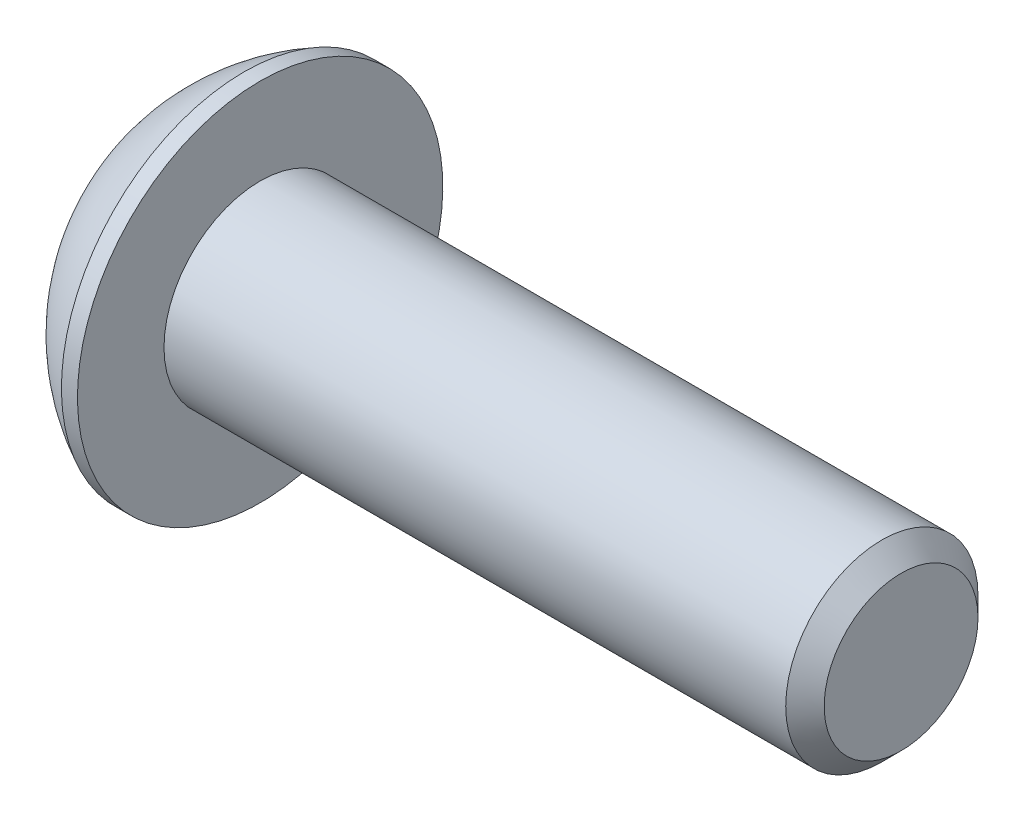
ISO-10303-21;
HEADER;
FILE_DESCRIPTION(('STEP AP214'),'2;1');
FILE_NAME('part.step','',(''),(''),'','','');
FILE_SCHEMA(('AUTOMOTIVE_DESIGN { 1 0 10303 214 1 1 1 1 }'));
ENDSEC;
DATA;
#1=APPLICATION_CONTEXT('core data for automotive mechanical design processes');
#2=APPLICATION_PROTOCOL_DEFINITION('international standard','automotive_design',2000,#1);
#3=PRODUCT_CONTEXT('',#1,'mechanical');
#4=PRODUCT('Part','Part','',(#3));
#5=PRODUCT_RELATED_PRODUCT_CATEGORY('part','',(#4));
#6=PRODUCT_DEFINITION_FORMATION('','',#4);
#7=PRODUCT_DEFINITION_CONTEXT('part definition',#1,'design');
#8=PRODUCT_DEFINITION('design','',#6,#7);
#9=PRODUCT_DEFINITION_SHAPE('','',#8);
#10=(LENGTH_UNIT() NAMED_UNIT(*) SI_UNIT(.MILLI.,.METRE.));
#11=(NAMED_UNIT(*) PLANE_ANGLE_UNIT() SI_UNIT($,.RADIAN.));
#12=(NAMED_UNIT(*) SI_UNIT($,.STERADIAN.) SOLID_ANGLE_UNIT());
#13=UNCERTAINTY_MEASURE_WITH_UNIT(LENGTH_MEASURE(1.E-05),#10,'distance_accuracy_value','');
#14=(GEOMETRIC_REPRESENTATION_CONTEXT(3) GLOBAL_UNCERTAINTY_ASSIGNED_CONTEXT((#13)) GLOBAL_UNIT_ASSIGNED_CONTEXT((#10,
#11,#12)) REPRESENTATION_CONTEXT('',''));
#15=CARTESIAN_POINT('',(0.,0.,0.));
#16=DIRECTION('',(0.,0.,1.));
#17=DIRECTION('',(1.,0.,0.));
#18=AXIS2_PLACEMENT_3D('',#15,#16,#17);
#19=CARTESIAN_POINT('',(-10.,0.,0.));
#20=DIRECTION('',(1.,0.,0.));
#21=DIRECTION('',(0.,0.,-1.));
#22=AXIS2_PLACEMENT_3D('',#19,#20,#21);
#23=CYLINDRICAL_SURFACE('',#22,1.5);
#24=CARTESIAN_POINT('',(-0.300000000000002,0.,0.));
#25=DIRECTION('',(1.,0.,0.));
#26=DIRECTION('',(0.,0.,-1.));
#27=AXIS2_PLACEMENT_3D('',#24,#25,#26);
#28=CIRCLE('',#27,1.5);
#29=CARTESIAN_POINT('',(-0.300000000000002,0.,-1.5));
#30=VERTEX_POINT('',#29);
#31=EDGE_CURVE('E55',#30,#30,#28,.F.);
#32=ORIENTED_EDGE('',*,*,#31,.T.);
#33=EDGE_LOOP('',(#32));
#34=FACE_BOUND('',#33,.T.);
#35=CARTESIAN_POINT('',(-10.,0.,0.));
#36=DIRECTION('',(1.,0.,0.));
#37=DIRECTION('',(0.,1.,0.));
#38=AXIS2_PLACEMENT_3D('',#35,#36,#37);
#39=CIRCLE('',#38,1.5);
#40=CARTESIAN_POINT('',(-10.,1.49999999999999,0.));
#41=VERTEX_POINT('',#40);
#42=EDGE_CURVE('E134',#41,#41,#39,.F.);
#43=ORIENTED_EDGE('',*,*,#42,.F.);
#44=EDGE_LOOP('',(#43));
#45=FACE_BOUND('',#44,.T.);
#46=ADVANCED_FACE('F41',(#34,#45),#23,.T.);
#47=CARTESIAN_POINT('',(0.,0.,0.));
#48=DIRECTION('',(1.,0.,0.));
#49=DIRECTION('',(0.,0.,-1.));
#50=AXIS2_PLACEMENT_3D('',#47,#48,#49);
#51=PLANE('',#50);
#52=CARTESIAN_POINT('',(0.,0.,0.));
#53=DIRECTION('',(1.,0.,0.));
#54=DIRECTION('',(0.,0.,-1.));
#55=AXIS2_PLACEMENT_3D('',#52,#53,#54);
#56=CIRCLE('',#55,1.2);
#57=CARTESIAN_POINT('',(0.,0.,-1.2));
#58=VERTEX_POINT('',#57);
#59=EDGE_CURVE('E137',#58,#58,#56,.T.);
#60=ORIENTED_EDGE('',*,*,#59,.T.);
#61=EDGE_LOOP('',(#60));
#62=FACE_BOUND('',#61,.T.);
#63=ADVANCED_FACE('F147',(#62),#51,.T.);
#64=CARTESIAN_POINT('',(0.,0.,0.));
#65=DIRECTION('',(-1.,0.,0.));
#66=DIRECTION('',(0.,0.,1.));
#67=AXIS2_PLACEMENT_3D('',#64,#65,#66);
#68=CONICAL_SURFACE('',#67,1.2,0.785398163397447);
#69=ORIENTED_EDGE('',*,*,#31,.F.);
#70=EDGE_LOOP('',(#69));
#71=FACE_BOUND('',#70,.T.);
#72=ORIENTED_EDGE('',*,*,#59,.F.);
#73=EDGE_LOOP('',(#72));
#74=FACE_BOUND('',#73,.T.);
#75=ADVANCED_FACE('F43',(#71,#74),#68,.T.);
#76=CARTESIAN_POINT('',(-11.65,0.,0.));
#77=DIRECTION('',(-1.,0.,0.));
#78=DIRECTION('',(0.,-1.,0.));
#79=AXIS2_PLACEMENT_3D('',#76,#77,#78);
#80=PLANE('',#79);
#81=CARTESIAN_POINT('',(-11.65,0.,0.));
#82=DIRECTION('',(-1.,0.,0.));
#83=DIRECTION('',(0.,-1.,0.));
#84=AXIS2_PLACEMENT_3D('',#81,#82,#83);
#85=CIRCLE('',#84,1.20470053837925);
#86=CARTESIAN_POINT('',(-11.65,-1.20470053837925,0.));
#87=VERTEX_POINT('',#86);
#88=EDGE_CURVE('E256',#87,#87,#85,.T.);
#89=ORIENTED_EDGE('',*,*,#88,.F.);
#90=EDGE_LOOP('',(#89));
#91=FACE_BOUND('',#90,.T.);
#92=CARTESIAN_POINT('',(-11.65,0.,0.));
#93=DIRECTION('',(1.,0.,0.));
#94=DIRECTION('',(0.,1.,0.));
#95=AXIS2_PLACEMENT_3D('',#92,#93,#94);
#96=CIRCLE('',#95,1.5);
#97=CARTESIAN_POINT('',(-11.65,1.5,0.));
#98=VERTEX_POINT('',#97);
#99=EDGE_CURVE('E131',#98,#98,#96,.T.);
#100=ORIENTED_EDGE('',*,*,#99,.F.);
#101=EDGE_LOOP('',(#100));
#102=FACE_BOUND('',#101,.T.);
#103=ADVANCED_FACE('F146',(#91,#102),#80,.T.);
#104=CARTESIAN_POINT('',(-8.85267857142857,0.,0.));
#105=DIRECTION('',(1.,0.,0.));
#106=DIRECTION('',(0.,1.,0.));
#107=AXIS2_PLACEMENT_3D('',#104,#105,#106);
#108=SPHERICAL_SURFACE('',#107,3.17411517981703);
#109=CARTESIAN_POINT('',(-10.25,0.,0.));
#110=DIRECTION('',(1.,0.,0.));
#111=DIRECTION('',(0.,1.,0.));
#112=AXIS2_PLACEMENT_3D('',#109,#110,#111);
#113=CIRCLE('',#112,2.85);
#114=CARTESIAN_POINT('',(-10.25,2.85,0.));
#115=VERTEX_POINT('',#114);
#116=EDGE_CURVE('E128',#115,#115,#113,.T.);
#117=CARTESIAN_POINT('',(-11.65,1.5,0.));
#118=CARTESIAN_POINT('',(-11.6402697017537,1.51814590550861,0.));
#119=CARTESIAN_POINT('',(-11.6303627914101,1.53619710575443,0.));
#120=CARTESIAN_POINT('',(-11.6101996026695,1.57210331824231,0.));
#121=CARTESIAN_POINT('',(-11.5999433242725,1.58995833048437,0.));
#122=CARTESIAN_POINT('',(-11.5790852555662,1.62546538948657,0.));
#123=CARTESIAN_POINT('',(-11.5684834652569,1.64311743624671,0.));
#124=CARTESIAN_POINT('',(-11.5469383951658,1.67821188357876,0.));
#125=CARTESIAN_POINT('',(-11.535995115384,1.69565428415069,0.));
#126=CARTESIAN_POINT('',(-11.513771208612,1.73032283245973,0.));
#127=CARTESIAN_POINT('',(-11.5024905816219,1.74754898019686,0.));
#128=CARTESIAN_POINT('',(-11.4795962529979,1.78177849951501,0.));
#129=CARTESIAN_POINT('',(-11.467982551364,1.79878187109604,0.));
#130=CARTESIAN_POINT('',(-11.4444264714719,1.8325593987641,0.));
#131=CARTESIAN_POINT('',(-11.4324840932136,1.84933355485112,0.));
#132=CARTESIAN_POINT('',(-11.4082751827463,1.88264629910089,0.));
#133=CARTESIAN_POINT('',(-11.3960086505372,1.89918488726362,0.));
#134=CARTESIAN_POINT('',(-11.3711560775515,1.93202023241769,0.));
#135=CARTESIAN_POINT('',(-11.3585700367748,1.94831698940902,0.));
#136=CARTESIAN_POINT('',(-11.3330832130497,1.98066250056315,0.));
#137=CARTESIAN_POINT('',(-11.3201824301012,1.99671125472595,0.));
#138=CARTESIAN_POINT('',(-11.2940710076189,2.02855468248373,0.));
#139=CARTESIAN_POINT('',(-11.2808603680851,2.04434935607872,0.));
#140=CARTESIAN_POINT('',(-11.254134235364,2.07567864118366,0.));
#141=CARTESIAN_POINT('',(-11.2406187421766,2.09121325269361,0.));
#142=CARTESIAN_POINT('',(-11.2132880205292,2.12201653059784,0.));
#143=CARTESIAN_POINT('',(-11.1994727920692,2.13728519699211,0.));
#144=CARTESIAN_POINT('',(-11.1715478317686,2.16755080234906,0.));
#145=CARTESIAN_POINT('',(-11.157438099928,2.18254774131173,0.));
#146=CARTESIAN_POINT('',(-11.1289294762883,2.21226421239399,0.));
#147=CARTESIAN_POINT('',(-11.1145305844891,2.22698374451358,0.));
#148=CARTESIAN_POINT('',(-11.0854490938605,2.25613982755347,0.));
#149=CARTESIAN_POINT('',(-11.0707664950309,2.27057637847377,0.));
#150=CARTESIAN_POINT('',(-11.0411231507109,2.29916103192521,0.));
#151=CARTESIAN_POINT('',(-11.0261624052204,2.31330913445635,0.));
#152=CARTESIAN_POINT('',(-10.9959684332833,2.34131153317633,0.));
#153=CARTESIAN_POINT('',(-10.9807352068367,2.35516582936518,0.));
#154=CARTESIAN_POINT('',(-10.9500020418819,2.38257536871332,0.));
#155=CARTESIAN_POINT('',(-10.9345021033738,2.3961306118726,0.));
#156=CARTESIAN_POINT('',(-10.9032413841958,2.42293691172714,0.));
#157=CARTESIAN_POINT('',(-10.887480603526,2.43618796842239,0.));
#158=CARTESIAN_POINT('',(-10.8557041687066,2.46238087711119,0.));
#159=CARTESIAN_POINT('',(-10.839688514557,2.47532272910475,0.));
#160=CARTESIAN_POINT('',(-10.8074083979817,2.50089232724988,0.));
#161=CARTESIAN_POINT('',(-10.7911439355561,2.51352007340145,0.));
#162=CARTESIAN_POINT('',(-10.7583723618573,2.53845667767541,0.));
#163=CARTESIAN_POINT('',(-10.7418652505841,2.55076553579779,0.));
#164=CARTESIAN_POINT('',(-10.7086146305115,2.57505970259155,0.));
#165=CARTESIAN_POINT('',(-10.691871121712,2.58704501126291,0.));
#166=CARTESIAN_POINT('',(-10.658154047431,2.61068754025891,0.));
#167=CARTESIAN_POINT('',(-10.6411804819494,2.62234476058354,0.));
#168=CARTESIAN_POINT('',(-10.607009722279,2.64532669825233,0.));
#169=CARTESIAN_POINT('',(-10.5898125280901,2.65665141559648,0.));
#170=CARTESIAN_POINT('',(-10.5552010236432,2.6789640585411,0.));
#171=CARTESIAN_POINT('',(-10.5377867133852,2.68995198414157,0.));
#172=CARTESIAN_POINT('',(-10.5027475717571,2.71158688256655,0.));
#173=CARTESIAN_POINT('',(-10.485122740387,2.72223385539107,0.));
#174=CARTESIAN_POINT('',(-10.449669230859,2.74318281565687,0.));
#175=CARTESIAN_POINT('',(-10.4318405527012,2.75348480309814,0.));
#176=CARTESIAN_POINT('',(-10.395986102456,2.7737398932333,0.));
#177=CARTESIAN_POINT('',(-10.3779603303685,2.78369299592719,0.));
#178=CARTESIAN_POINT('',(-10.3417185147769,2.8032465396409,0.));
#179=CARTESIAN_POINT('',(-10.3235024712727,2.81284698066071,0.));
#180=CARTESIAN_POINT('',(-10.2868870260232,2.83169159380608,0.));
#181=CARTESIAN_POINT('',(-10.268487624278,2.84093576593165,0.));
#182=CARTESIAN_POINT('',(-10.25,2.85,0.));
#183=B_SPLINE_CURVE_WITH_KNOTS('',3,(#117,#118,#119,#120,#121,#122,#123,#124,#125,#126,#127,
#128,#129,#130,#131,#132,#133,#134,#135,#136,#137,#138,#139,#140,#141,#142,#143,#144,#145,#146,
#147,#148,#149,#150,#151,#152,#153,#154,#155,#156,#157,#158,#159,#160,#161,#162,#163,#164,#165,
#166,#167,#168,#169,#170,#171,#172,#173,#174,#175,#176,#177,#178,#179,#180,#181,#182),
.UNSPECIFIED.,.F.,.F.,(4,2,2,2,2,2,2,2,2,2,2,2,2,2,2,2,2,2,2,2,2,2,2,2,2,2,2,2,2,2,2,2,4),(0.,
0.0617693508858101,0.12353870177162,0.185308052657428,0.247077403543238,0.308846754429047,
0.370616105314857,0.432385456200666,0.494154807086476,0.555924157972286,0.617693508858095,
0.679462859743904,0.741232210629714,0.803001561515523,0.864770912401332,0.926540263287142,
0.988309614172952,1.05007896505876,1.11184831594457,1.17361766683038,1.23538701771619,
1.297156368602,1.35892571948781,1.42069507037362,1.48246442125943,1.54423377214524,
1.60600312303105,1.66777247391686,1.72954182480266,1.79131117568847,1.85308052657428,
1.91484987746009,1.9766192283459),.UNSPECIFIED.);
#184=EDGE_CURVE('BSEAM158',#98,#115,#183,.T.);
#185=ORIENTED_EDGE('',*,*,#99,.T.);
#186=ORIENTED_EDGE('',*,*,#116,.F.);
#187=ORIENTED_EDGE('',*,*,#184,.T.);
#188=ORIENTED_EDGE('',*,*,#184,.F.);
#189=EDGE_LOOP('',(#185,#187,#186,#188));
#190=FACE_BOUND('',#189,.T.);
#191=ADVANCED_FACE('F158',(#190),#108,.T.);
#192=CARTESIAN_POINT('',(-10.,0.,0.));
#193=DIRECTION('',(1.,0.,0.));
#194=DIRECTION('',(0.,1.,0.));
#195=AXIS2_PLACEMENT_3D('',#192,#193,#194);
#196=CYLINDRICAL_SURFACE('',#195,2.85);
#197=ORIENTED_EDGE('',*,*,#116,.T.);
#198=EDGE_LOOP('',(#197));
#199=FACE_BOUND('',#198,.T.);
#200=CARTESIAN_POINT('',(-10.,0.,0.));
#201=DIRECTION('',(1.,0.,0.));
#202=DIRECTION('',(0.,1.,0.));
#203=AXIS2_PLACEMENT_3D('',#200,#201,#202);
#204=CIRCLE('',#203,2.85);
#205=CARTESIAN_POINT('',(-10.,2.85,0.));
#206=VERTEX_POINT('',#205);
#207=EDGE_CURVE('E125',#206,#206,#204,.T.);
#208=ORIENTED_EDGE('',*,*,#207,.F.);
#209=EDGE_LOOP('',(#208));
#210=FACE_BOUND('',#209,.T.);
#211=ADVANCED_FACE('F162',(#199,#210),#196,.T.);
#212=CARTESIAN_POINT('',(-10.,2.85,0.));
#213=DIRECTION('',(1.,0.,0.));
#214=DIRECTION('',(0.,1.,0.));
#215=AXIS2_PLACEMENT_3D('',#212,#213,#214);
#216=PLANE('',#215);
#217=ORIENTED_EDGE('',*,*,#42,.T.);
#218=EDGE_LOOP('',(#217));
#219=FACE_BOUND('',#218,.T.);
#220=ORIENTED_EDGE('',*,*,#207,.T.);
#221=EDGE_LOOP('',(#220));
#222=FACE_BOUND('',#221,.T.);
#223=ADVANCED_FACE('F166',(#219,#222),#216,.T.);
#224=CARTESIAN_POINT('',(-11.65,0.,0.));
#225=DIRECTION('',(-1.,0.,0.));
#226=DIRECTION('',(0.,-1.,0.));
#227=AXIS2_PLACEMENT_3D('',#224,#225,#226);
#228=CONICAL_SURFACE('',#227,1.20470053837925,0.78539816339745);
#229=ORIENTED_EDGE('',*,*,#88,.T.);
#230=EDGE_LOOP('',(#229));
#231=FACE_BOUND('',#230,.T.);
#232=CARTESIAN_POINT('',(-12.0125645579163,-1.20678079288095,1.));
#233=CARTESIAN_POINT('',(-11.9901238799752,-1.17763239380937,1.));
#234=CARTESIAN_POINT('',(-11.9678867609271,-1.14832777655038,1.));
#235=CARTESIAN_POINT('',(-11.9239053230859,-1.08934073997339,1.));
#236=CARTESIAN_POINT('',(-11.902161120887,-1.05965823380995,1.));
#237=CARTESIAN_POINT('',(-11.8374858802222,-0.969511619364372,1.));
#238=CARTESIAN_POINT('',(-11.795456442765,-0.908390032886403,1.));
#239=CARTESIAN_POINT('',(-11.7124203349119,-0.779849899214028,1.));
#240=CARTESIAN_POINT('',(-11.6716484956871,-0.712278047733955,1.));
#241=CARTESIAN_POINT('',(-11.5967056855403,-0.573692441836173,1.));
#242=CARTESIAN_POINT('',(-11.5625124208036,-0.502691370033584,1.));
#243=CARTESIAN_POINT('',(-11.5206648240494,-0.396633108483662,1.));
#244=CARTESIAN_POINT('',(-11.5087524246011,-0.36326511472309,1.));
#245=CARTESIAN_POINT('',(-11.4876010580815,-0.295675144863687,1.));
#246=CARTESIAN_POINT('',(-11.4783622608543,-0.261453114661027,1.));
#247=CARTESIAN_POINT('',(-11.4632108375931,-0.192964714439421,1.));
#248=CARTESIAN_POINT('',(-11.4572372079353,-0.158712062702426,1.));
#249=CARTESIAN_POINT('',(-11.4487381792859,-0.0897678989597836,1.));
#250=CARTESIAN_POINT('',(-11.4462131691608,-0.0550763379077854,1.));
#251=CARTESIAN_POINT('',(-11.4448308242394,0.0128534343372067,1.));
#252=CARTESIAN_POINT('',(-11.4458171333425,0.046088491841472,1.));
#253=CARTESIAN_POINT('',(-11.4510428296463,0.11228877752336,1.));
#254=CARTESIAN_POINT('',(-11.4552814228284,0.145254069576932,1.));
#255=CARTESIAN_POINT('',(-11.4668431932388,0.211252641710479,1.));
#256=CARTESIAN_POINT('',(-11.4742213991969,0.244276126106422,1.));
#257=CARTESIAN_POINT('',(-11.4916537633013,0.309593416178912,1.));
#258=CARTESIAN_POINT('',(-11.5017077720937,0.341887262472142,1.));
#259=CARTESIAN_POINT('',(-11.5364692676108,0.44118855611672,1.));
#260=CARTESIAN_POINT('',(-11.5650343603337,0.506841480843492,1.));
#261=CARTESIAN_POINT('',(-11.6286033694253,0.635081389212377,1.));
#262=CARTESIAN_POINT('',(-11.663629955309,0.697656564069536,1.));
#263=CARTESIAN_POINT('',(-11.7359546107891,0.817274369694626,1.));
#264=CARTESIAN_POINT('',(-11.7730556162911,0.874437672313596,1.));
#265=CARTESIAN_POINT('',(-11.8304371678966,0.9586557103035,1.));
#266=CARTESIAN_POINT('',(-11.8497720189249,0.986366163766967,1.));
#267=CARTESIAN_POINT('',(-11.8889602713879,1.04140691974411,1.));
#268=CARTESIAN_POINT('',(-11.908813529201,1.06873732439883,1.));
#269=CARTESIAN_POINT('',(-11.92888195229,1.09590921458871,1.));
#270=B_SPLINE_CURVE_WITH_KNOTS('',3,(#232,#233,#234,#235,#236,#237,#238,#239,#240,#241,#242,
#243,#244,#245,#246,#247,#248,#249,#250,#251,#252,#253,#254,#255,#256,#257,#258,#259,#260,#261,
#262,#263,#264,#265,#266,#267,#268,#269),.UNSPECIFIED.,.F.,.F.,(4,2,2,2,2,2,2,2,2,2,2,2,2,2,2,2,
2,2,4),(0.,0.110355487284535,0.220736811203826,0.443178348562912,0.679759335181115,
0.915523888816463,1.02172703810024,1.1279369325962,1.23208803653002,1.33625088357216,
1.43583459192535,1.53539399546241,1.63677534642523,1.73815103982915,1.95232008261278,
2.16725532249797,2.37159620059983,2.47295962852456,2.57429526618464),.UNSPECIFIED.);
#271=CARTESIAN_POINT('',(-11.6,-0.577350269189625,1.));
#272=VERTEX_POINT('',#271);
#273=CARTESIAN_POINT('',(-11.6,0.577350269189627,1.));
#274=VERTEX_POINT('',#273);
#275=EDGE_CURVE('E109',#272,#274,#270,.T.);
#276=ORIENTED_EDGE('',*,*,#275,.F.);
#277=CARTESIAN_POINT('',(-11.6001154873726,-1.15481600843309,-0.000200000000000694));
#278=CARTESIAN_POINT('',(-11.5802779308257,-1.13496520795025,0.0341825950071802));
#279=CARTESIAN_POINT('',(-11.5616050206389,-1.11478247255942,0.0691401181398245));
#280=CARTESIAN_POINT('',(-11.5274147427232,-1.07362739529219,0.140422802956089));
#281=CARTESIAN_POINT('',(-11.5119164090235,-1.0526511355808,0.176754750528984));
#282=CARTESIAN_POINT('',(-11.4853673071423,-1.01035337909803,0.250016613803311));
#283=CARTESIAN_POINT('',(-11.4742497739969,-0.989042666109239,0.286927851445414));
#284=CARTESIAN_POINT('',(-11.4571198657762,-0.94595219928269,0.361562729310859));
#285=CARTESIAN_POINT('',(-11.4510946974667,-0.924173762626595,0.399284088108636));
#286=CARTESIAN_POINT('',(-11.4456605549675,-0.886641312640013,0.464292198417934));
#287=CARTESIAN_POINT('',(-11.4448569383167,-0.870936130672274,0.491494371528172));
#288=CARTESIAN_POINT('',(-11.4462066994169,-0.839556179862847,0.545846040669112));
#289=CARTESIAN_POINT('',(-11.4483607295472,-0.823881418494922,0.572995523754876));
#290=CARTESIAN_POINT('',(-11.4591169721285,-0.777080970599365,0.654056277326961));
#291=CARTESIAN_POINT('',(-11.4720145564154,-0.746188191116429,0.707564140978428));
#292=CARTESIAN_POINT('',(-11.5031407306022,-0.691968116419648,0.801476065143432));
#293=CARTESIAN_POINT('',(-11.5197377977018,-0.66838655729337,0.842320523671834));
#294=CARTESIAN_POINT('',(-11.5571249246853,-0.622147085933681,0.922409637381944));
#295=CARTESIAN_POINT('',(-11.5779013418174,-0.599486449584574,0.961659010870438));
#296=CARTESIAN_POINT('',(-11.6001154873726,-0.577234799135787,1.0002));
#297=B_SPLINE_CURVE_WITH_KNOTS('',3,(#277,#278,#279,#280,#281,#282,#283,#284,#285,#286,#287,
#288,#289,#290,#291,#292,#293,#294,#295,#296),.UNSPECIFIED.,.F.,.F.,(4,2,2,2,2,2,2,2,2,4),(0.,
0.133237676828559,0.267252229834491,0.3991370762693,0.530689603280769,0.624814864263847,
0.718960890149134,0.907306626112098,1.05710100361789,1.20641411519286),.UNSPECIFIED.);
#298=CARTESIAN_POINT('',(-11.6,-1.15470053837925,0.));
#299=VERTEX_POINT('',#298);
#300=EDGE_CURVE('E212',#299,#272,#297,.T.);
#301=ORIENTED_EDGE('',*,*,#300,.F.);
#302=CARTESIAN_POINT('',(-11.6001154873726,-0.577234799135787,-1.0002));
#303=CARTESIAN_POINT('',(-11.5802779308257,-0.597085599618621,-0.965817404992819));
#304=CARTESIAN_POINT('',(-11.5616050206389,-0.617268335009456,-0.930859881860175));
#305=CARTESIAN_POINT('',(-11.5274147427232,-0.658423412276685,-0.85957719704391));
#306=CARTESIAN_POINT('',(-11.5119164090235,-0.679399671988079,-0.823245249471015));
#307=CARTESIAN_POINT('',(-11.4853673071423,-0.721697428470846,-0.749983386196688));
#308=CARTESIAN_POINT('',(-11.4742497739969,-0.743008141459636,-0.713072148554585));
#309=CARTESIAN_POINT('',(-11.4571198657762,-0.786098608286186,-0.63843727068914));
#310=CARTESIAN_POINT('',(-11.4510946974667,-0.807877044942281,-0.600715911891363));
#311=CARTESIAN_POINT('',(-11.4456605549675,-0.845409494928862,-0.535707801582066));
#312=CARTESIAN_POINT('',(-11.4448569383167,-0.861114676896601,-0.508505628471827));
#313=CARTESIAN_POINT('',(-11.4462066994169,-0.892494627706029,-0.454153959330887));
#314=CARTESIAN_POINT('',(-11.4483607295472,-0.908169389073953,-0.427004476245123));
#315=CARTESIAN_POINT('',(-11.4591169721285,-0.95496983696951,-0.345943722673039));
#316=CARTESIAN_POINT('',(-11.4720145564154,-0.985862616452447,-0.292435859021572));
#317=CARTESIAN_POINT('',(-11.5031407306022,-1.04008269114923,-0.198523934856568));
#318=CARTESIAN_POINT('',(-11.5197377977018,-1.06366425027551,-0.157679476328165));
#319=CARTESIAN_POINT('',(-11.5571249246853,-1.1099037216352,-0.077590362618056));
#320=CARTESIAN_POINT('',(-11.5779013418174,-1.1325643579843,-0.0383409891295624));
#321=CARTESIAN_POINT('',(-11.6001154873726,-1.15481600843309,0.000199999999999208));
#322=B_SPLINE_CURVE_WITH_KNOTS('',3,(#302,#303,#304,#305,#306,#307,#308,#309,#310,#311,#312,
#313,#314,#315,#316,#317,#318,#319,#320,#321),.UNSPECIFIED.,.F.,.F.,(4,2,2,2,2,2,2,2,2,4),(0.,
0.13323767682856,0.267252229834491,0.399137076269301,0.530689603280768,0.624814864263846,
0.718960890149134,0.907306626112098,1.05710100361789,1.20641411519286),.UNSPECIFIED.);
#323=CARTESIAN_POINT('',(-11.6,-0.577350269189625,-1.));
#324=VERTEX_POINT('',#323);
#325=EDGE_CURVE('E206',#324,#299,#322,.T.);
#326=ORIENTED_EDGE('',*,*,#325,.F.);
#327=CARTESIAN_POINT('',(-12.0125650614172,-1.2067814467853,-1.));
#328=CARTESIAN_POINT('',(-11.9901243639822,-1.17763302882143,-1.));
#329=CARTESIAN_POINT('',(-11.9678872254711,-1.14832839261351,-1.));
#330=CARTESIAN_POINT('',(-11.9239057488155,-1.08934131795804,-1.));
#331=CARTESIAN_POINT('',(-11.9021615272652,-1.05965879266497,-1.));
#332=CARTESIAN_POINT('',(-11.837486228163,-0.969512119697535,-1.));
#333=CARTESIAN_POINT('',(-11.7954567519025,-0.908390493450852,-1.));
#334=CARTESIAN_POINT('',(-11.7124205639502,-0.779850272991497,-1.));
#335=CARTESIAN_POINT('',(-11.67164868372,-0.712278374260636,-1.));
#336=CARTESIAN_POINT('',(-11.5967057974366,-0.57369266987768,-1.));
#337=CARTESIAN_POINT('',(-11.5625124975185,-0.502691546873997,-1.));
#338=CARTESIAN_POINT('',(-11.5206648756312,-0.396633247077982,-1.));
#339=CARTESIAN_POINT('',(-11.5087524781389,-0.363265269879148,-1.));
#340=CARTESIAN_POINT('',(-11.4876011122146,-0.295675333788391,-1.));
#341=CARTESIAN_POINT('',(-11.4783623136285,-0.261453320791982,-1.));
#342=CARTESIAN_POINT('',(-11.4632108836686,-0.19296495445634,-1.));
#343=CARTESIAN_POINT('',(-11.4572372487852,-0.158712319385971,-1.));
#344=CARTESIAN_POINT('',(-11.4487382057865,-0.0897681885429875,-1.));
#345=CARTESIAN_POINT('',(-11.446213186537,-0.055076643723987,-1.));
#346=CARTESIAN_POINT('',(-11.4448308203586,0.0128531008985453,-1.));
#347=CARTESIAN_POINT('',(-11.445817117779,0.0460881469709584,-1.));
#348=CARTESIAN_POINT('',(-11.4510427890576,0.112288411077531,-1.));
#349=CARTESIAN_POINT('',(-11.4552813688957,0.145253692987464,-1.));
#350=CARTESIAN_POINT('',(-11.4668431114854,0.211252245100415,-1.));
#351=CARTESIAN_POINT('',(-11.474221302878,0.244275719655904,-1.));
#352=CARTESIAN_POINT('',(-11.4916536376949,0.309592991103826,-1.));
#353=CARTESIAN_POINT('',(-11.5017076317658,0.34188682861279,-1.));
#354=CARTESIAN_POINT('',(-11.5364690589811,0.441188030105118,-1.));
#355=CARTESIAN_POINT('',(-11.5650340890574,0.506840876086072,-1.));
#356=CARTESIAN_POINT('',(-11.6286029659001,0.63508063302443,-1.));
#357=CARTESIAN_POINT('',(-11.663629482132,0.69765573523401,-1.));
#358=CARTESIAN_POINT('',(-11.7359540043354,0.817273410459789,-1.));
#359=CARTESIAN_POINT('',(-11.7730549468409,0.874436654853343,-1.));
#360=CARTESIAN_POINT('',(-11.8304364042781,0.958654606765371,-1.));
#361=CARTESIAN_POINT('',(-11.8497712241667,0.986365031952258,-1.));
#362=CARTESIAN_POINT('',(-11.8889594143893,1.04140573156301,-1.));
#363=CARTESIAN_POINT('',(-11.9088126411017,1.06873610812795,-1.));
#364=CARTESIAN_POINT('',(-11.9288810331298,1.09590797027909,-1.));
#365=B_SPLINE_CURVE_WITH_KNOTS('',3,(#327,#328,#329,#330,#331,#332,#333,#334,#335,#336,#337,
#338,#339,#340,#341,#342,#343,#344,#345,#346,#347,#348,#349,#350,#351,#352,#353,#354,#355,#356,
#357,#358,#359,#360,#361,#362,#363,#364),.UNSPECIFIED.,.F.,.F.,(4,2,2,2,2,2,2,2,2,2,2,2,2,2,2,2,
2,2,4),(0.,0.110355567866854,0.22073697239189,0.443178673979239,0.679759845471898,
0.915524582194849,1.02172768288056,1.12793752886233,1.2320885865257,1.33625138728837,
1.43583506047457,1.53539442879914,1.63677574143708,1.73815139653142,1.95232014898535,
2.16725509662759,2.3715957252827,2.47295903017567,2.57429454481414),.UNSPECIFIED.);
#366=CARTESIAN_POINT('',(-11.6,0.577350269189627,-1.));
#367=VERTEX_POINT('',#366);
#368=EDGE_CURVE('E62',#367,#324,#365,.F.);
#369=ORIENTED_EDGE('',*,*,#368,.F.);
#370=CARTESIAN_POINT('',(-11.6001154873726,1.15481600843309,0.000199999999999986));
#371=CARTESIAN_POINT('',(-11.5802779308257,1.13496520795026,-0.034182595007181));
#372=CARTESIAN_POINT('',(-11.5616050206389,1.11478247255942,-0.0691401181398252));
#373=CARTESIAN_POINT('',(-11.5274147427232,1.07362739529219,-0.14042280295609));
#374=CARTESIAN_POINT('',(-11.5119164090235,1.0526511355808,-0.176754750528985));
#375=CARTESIAN_POINT('',(-11.4853673071423,1.01035337909803,-0.250016613803312));
#376=CARTESIAN_POINT('',(-11.4742497739969,0.989042666109241,-0.286927851445416));
#377=CARTESIAN_POINT('',(-11.4571198657762,0.945952199282691,-0.361562729310861));
#378=CARTESIAN_POINT('',(-11.4510946974667,0.924173762626596,-0.399284088108638));
#379=CARTESIAN_POINT('',(-11.4456605549675,0.886641312640015,-0.464292198417935));
#380=CARTESIAN_POINT('',(-11.4448569383167,0.870936130672275,-0.491494371528174));
#381=CARTESIAN_POINT('',(-11.4462066994169,0.839556179862848,-0.545846040669114));
#382=CARTESIAN_POINT('',(-11.4483607295472,0.823881418494924,-0.572995523754877));
#383=CARTESIAN_POINT('',(-11.4591169721285,0.777080970599367,-0.654056277326962));
#384=CARTESIAN_POINT('',(-11.4720145564154,0.74618819111643,-0.707564140978429));
#385=CARTESIAN_POINT('',(-11.5031407306022,0.69196811641965,-0.801476065143433));
#386=CARTESIAN_POINT('',(-11.5197377977018,0.668386557293372,-0.842320523671836));
#387=CARTESIAN_POINT('',(-11.5571249246853,0.622147085933682,-0.922409637381945));
#388=CARTESIAN_POINT('',(-11.5779013418174,0.599486449584576,-0.961659010870439));
#389=CARTESIAN_POINT('',(-11.6001154873726,0.577234799135789,-1.0002));
#390=B_SPLINE_CURVE_WITH_KNOTS('',3,(#370,#371,#372,#373,#374,#375,#376,#377,#378,#379,#380,
#381,#382,#383,#384,#385,#386,#387,#388,#389),.UNSPECIFIED.,.F.,.F.,(4,2,2,2,2,2,2,2,2,4),(0.,
0.133237676828559,0.267252229834491,0.399137076269301,0.53068960328077,0.624814864263848,
0.718960890149135,0.907306626112099,1.0571010036179,1.20641411519286),.UNSPECIFIED.);
#391=CARTESIAN_POINT('',(-11.6,1.15470053837925,0.));
#392=VERTEX_POINT('',#391);
#393=EDGE_CURVE('E11',#392,#367,#390,.T.);
#394=ORIENTED_EDGE('',*,*,#393,.F.);
#395=CARTESIAN_POINT('',(-11.6001154873726,0.577234799135789,1.0002));
#396=CARTESIAN_POINT('',(-11.5802779308257,0.597085599618623,0.965817404992819));
#397=CARTESIAN_POINT('',(-11.5616050206389,0.617268335009457,0.930859881860175));
#398=CARTESIAN_POINT('',(-11.5274147427232,0.658423412276687,0.85957719704391));
#399=CARTESIAN_POINT('',(-11.5119164090235,0.679399671988081,0.823245249471016));
#400=CARTESIAN_POINT('',(-11.4853673071423,0.721697428470847,0.749983386196689));
#401=CARTESIAN_POINT('',(-11.4742497739969,0.743008141459638,0.713072148554585));
#402=CARTESIAN_POINT('',(-11.4571198657762,0.786098608286187,0.638437270689141));
#403=CARTESIAN_POINT('',(-11.4510946974667,0.807877044942282,0.600715911891364));
#404=CARTESIAN_POINT('',(-11.4456605549675,0.845409494928864,0.535707801582066));
#405=CARTESIAN_POINT('',(-11.4448569383167,0.861114676896603,0.508505628471827));
#406=CARTESIAN_POINT('',(-11.4462066994169,0.89249462770603,0.454153959330888));
#407=CARTESIAN_POINT('',(-11.4483607295472,0.908169389073955,0.427004476245124));
#408=CARTESIAN_POINT('',(-11.4591169721285,0.954969836969512,0.345943722673039));
#409=CARTESIAN_POINT('',(-11.4720145564154,0.985862616452448,0.292435859021572));
#410=CARTESIAN_POINT('',(-11.5031407306022,1.04008269114923,0.198523934856568));
#411=CARTESIAN_POINT('',(-11.5197377977018,1.06366425027551,0.157679476328166));
#412=CARTESIAN_POINT('',(-11.5571249246853,1.1099037216352,0.0775903626180563));
#413=CARTESIAN_POINT('',(-11.5779013418174,1.1325643579843,0.0383409891295624));
#414=CARTESIAN_POINT('',(-11.6001154873726,1.15481600843309,-0.000199999999999613));
#415=B_SPLINE_CURVE_WITH_KNOTS('',3,(#395,#396,#397,#398,#399,#400,#401,#402,#403,#404,#405,
#406,#407,#408,#409,#410,#411,#412,#413,#414),.UNSPECIFIED.,.F.,.F.,(4,2,2,2,2,2,2,2,2,4),(0.,
0.133237676828559,0.26725222983449,0.399137076269299,0.530689603280768,0.624814864263846,
0.718960890149133,0.907306626112097,1.05710100361789,1.20641411519286),.UNSPECIFIED.);
#416=EDGE_CURVE('E100',#274,#392,#415,.T.);
#417=ORIENTED_EDGE('',*,*,#416,.F.);
#418=EDGE_LOOP('',(#276,#301,#326,#369,#394,#417));
#419=FACE_BOUND('',#418,.T.);
#420=ADVANCED_FACE('F99',(#231,#419),#228,.F.);
#421=CARTESIAN_POINT('',(-10.45,0.,0.));
#422=DIRECTION('',(-1.,0.,0.));
#423=DIRECTION('',(0.,0.,1.));
#424=AXIS2_PLACEMENT_3D('',#421,#422,#423);
#425=PLANE('',#424);
#426=DIRECTION('',(0.,0.5,-0.866025403784439));
#427=VECTOR('',#426,1.);
#428=CARTESIAN_POINT('',(-10.45,0.577350269189627,1.));
#429=LINE('',#428,#427);
#430=CARTESIAN_POINT('',(-10.45,0.577350269189627,1.));
#431=VERTEX_POINT('',#430);
#432=CARTESIAN_POINT('',(-10.45,1.15470053837925,0.));
#433=VERTEX_POINT('',#432);
#434=EDGE_CURVE('E108',#431,#433,#429,.T.);
#435=ORIENTED_EDGE('',*,*,#434,.T.);
#436=DIRECTION('',(0.,-0.5,-0.866025403784439));
#437=VECTOR('',#436,1.);
#438=CARTESIAN_POINT('',(-10.45,1.15470053837925,0.));
#439=LINE('',#438,#437);
#440=CARTESIAN_POINT('',(-10.45,0.577350269189627,-1.));
#441=VERTEX_POINT('',#440);
#442=EDGE_CURVE('E113',#433,#441,#439,.T.);
#443=ORIENTED_EDGE('',*,*,#442,.T.);
#444=DIRECTION('',(0.,-1.,0.));
#445=VECTOR('',#444,1.);
#446=CARTESIAN_POINT('',(-10.45,0.577350269189627,-1.));
#447=LINE('',#446,#445);
#448=CARTESIAN_POINT('',(-10.45,-0.577350269189625,-1.));
#449=VERTEX_POINT('',#448);
#450=EDGE_CURVE('E238',#441,#449,#447,.T.);
#451=ORIENTED_EDGE('',*,*,#450,.T.);
#452=DIRECTION('',(0.,-0.5,0.866025403784439));
#453=VECTOR('',#452,1.);
#454=CARTESIAN_POINT('',(-10.45,-0.577350269189625,-1.));
#455=LINE('',#454,#453);
#456=CARTESIAN_POINT('',(-10.45,-1.15470053837925,0.));
#457=VERTEX_POINT('',#456);
#458=EDGE_CURVE('E242',#449,#457,#455,.T.);
#459=ORIENTED_EDGE('',*,*,#458,.T.);
#460=DIRECTION('',(0.,0.5,0.866025403784439));
#461=VECTOR('',#460,1.);
#462=CARTESIAN_POINT('',(-10.45,-1.15470053837925,0.));
#463=LINE('',#462,#461);
#464=CARTESIAN_POINT('',(-10.45,-0.577350269189625,1.));
#465=VERTEX_POINT('',#464);
#466=EDGE_CURVE('E121',#457,#465,#463,.T.);
#467=ORIENTED_EDGE('',*,*,#466,.T.);
#468=DIRECTION('',(0.,1.,0.));
#469=VECTOR('',#468,1.);
#470=CARTESIAN_POINT('',(-10.45,-0.577350269189625,1.));
#471=LINE('',#470,#469);
#472=EDGE_CURVE('E116',#465,#431,#471,.T.);
#473=ORIENTED_EDGE('',*,*,#472,.T.);
#474=EDGE_LOOP('',(#435,#443,#451,#459,#467,#473));
#475=FACE_BOUND('',#474,.T.);
#476=ADVANCED_FACE('F192',(#475),#425,.T.);
#477=CARTESIAN_POINT('',(-10.45,1.15470053837925,0.));
#478=DIRECTION('',(0.,0.866025403784439,-0.5));
#479=DIRECTION('',(0.,0.5,0.866025403784439));
#480=AXIS2_PLACEMENT_3D('',#477,#478,#479);
#481=PLANE('',#480);
#482=DIRECTION('',(-1.,0.,0.));
#483=VECTOR('',#482,1.);
#484=CARTESIAN_POINT('',(-10.45,1.15470053837925,0.));
#485=LINE('',#484,#483);
#486=EDGE_CURVE('E106',#433,#392,#485,.T.);
#487=ORIENTED_EDGE('',*,*,#486,.T.);
#488=ORIENTED_EDGE('',*,*,#393,.T.);
#489=DIRECTION('',(-1.,0.,0.));
#490=VECTOR('',#489,1.);
#491=CARTESIAN_POINT('',(-10.45,0.577350269189627,-1.));
#492=LINE('',#491,#490);
#493=EDGE_CURVE('E115',#441,#367,#492,.T.);
#494=ORIENTED_EDGE('',*,*,#493,.F.);
#495=ORIENTED_EDGE('',*,*,#442,.F.);
#496=EDGE_LOOP('',(#487,#488,#494,#495));
#497=FACE_BOUND('',#496,.T.);
#498=ADVANCED_FACE('F111',(#497),#481,.F.);
#499=CARTESIAN_POINT('',(-10.45,0.577350269189627,-1.));
#500=DIRECTION('',(0.,0.,-1.));
#501=DIRECTION('',(0.,1.,0.));
#502=AXIS2_PLACEMENT_3D('',#499,#500,#501);
#503=PLANE('',#502);
#504=ORIENTED_EDGE('',*,*,#493,.T.);
#505=ORIENTED_EDGE('',*,*,#368,.T.);
#506=DIRECTION('',(-1.,0.,0.));
#507=VECTOR('',#506,1.);
#508=CARTESIAN_POINT('',(-10.45,-0.577350269189625,-1.));
#509=LINE('',#508,#507);
#510=EDGE_CURVE('E118',#449,#324,#509,.T.);
#511=ORIENTED_EDGE('',*,*,#510,.F.);
#512=ORIENTED_EDGE('',*,*,#450,.F.);
#513=EDGE_LOOP('',(#504,#505,#511,#512));
#514=FACE_BOUND('',#513,.T.);
#515=ADVANCED_FACE('F227',(#514),#503,.F.);
#516=CARTESIAN_POINT('',(-10.45,-0.577350269189625,-1.));
#517=DIRECTION('',(0.,-0.866025403784439,-0.5));
#518=DIRECTION('',(0.,0.5,-0.866025403784439));
#519=AXIS2_PLACEMENT_3D('',#516,#517,#518);
#520=PLANE('',#519);
#521=ORIENTED_EDGE('',*,*,#510,.T.);
#522=ORIENTED_EDGE('',*,*,#325,.T.);
#523=DIRECTION('',(-1.,0.,0.));
#524=VECTOR('',#523,1.);
#525=CARTESIAN_POINT('',(-10.45,-1.15470053837925,0.));
#526=LINE('',#525,#524);
#527=EDGE_CURVE('E252',#457,#299,#526,.T.);
#528=ORIENTED_EDGE('',*,*,#527,.F.);
#529=ORIENTED_EDGE('',*,*,#458,.F.);
#530=EDGE_LOOP('',(#521,#522,#528,#529));
#531=FACE_BOUND('',#530,.T.);
#532=ADVANCED_FACE('F222',(#531),#520,.F.);
#533=CARTESIAN_POINT('',(-10.45,-1.15470053837925,0.));
#534=DIRECTION('',(0.,-0.866025403784439,0.5));
#535=DIRECTION('',(0.,-0.5,-0.866025403784439));
#536=AXIS2_PLACEMENT_3D('',#533,#534,#535);
#537=PLANE('',#536);
#538=ORIENTED_EDGE('',*,*,#527,.T.);
#539=ORIENTED_EDGE('',*,*,#300,.T.);
#540=DIRECTION('',(-1.,0.,0.));
#541=VECTOR('',#540,1.);
#542=CARTESIAN_POINT('',(-10.45,-0.577350269189625,1.));
#543=LINE('',#542,#541);
#544=EDGE_CURVE('E249',#465,#272,#543,.T.);
#545=ORIENTED_EDGE('',*,*,#544,.F.);
#546=ORIENTED_EDGE('',*,*,#466,.F.);
#547=EDGE_LOOP('',(#538,#539,#545,#546));
#548=FACE_BOUND('',#547,.T.);
#549=ADVANCED_FACE('F219',(#548),#537,.F.);
#550=CARTESIAN_POINT('',(-10.45,-0.577350269189625,1.));
#551=DIRECTION('',(0.,0.,1.));
#552=DIRECTION('',(1.,0.,0.));
#553=AXIS2_PLACEMENT_3D('',#550,#551,#552);
#554=PLANE('',#553);
#555=ORIENTED_EDGE('',*,*,#544,.T.);
#556=ORIENTED_EDGE('',*,*,#275,.T.);
#557=DIRECTION('',(-1.,0.,0.));
#558=VECTOR('',#557,1.);
#559=CARTESIAN_POINT('',(-10.45,0.577350269189627,1.));
#560=LINE('',#559,#558);
#561=EDGE_CURVE('E69',#431,#274,#560,.T.);
#562=ORIENTED_EDGE('',*,*,#561,.F.);
#563=ORIENTED_EDGE('',*,*,#472,.F.);
#564=EDGE_LOOP('',(#555,#556,#562,#563));
#565=FACE_BOUND('',#564,.T.);
#566=ADVANCED_FACE('F173',(#565),#554,.F.);
#567=CARTESIAN_POINT('',(-10.45,0.577350269189627,1.));
#568=DIRECTION('',(0.,0.866025403784439,0.5));
#569=DIRECTION('',(0.,-0.5,0.866025403784439));
#570=AXIS2_PLACEMENT_3D('',#567,#568,#569);
#571=PLANE('',#570);
#572=ORIENTED_EDGE('',*,*,#561,.T.);
#573=ORIENTED_EDGE('',*,*,#416,.T.);
#574=ORIENTED_EDGE('',*,*,#486,.F.);
#575=ORIENTED_EDGE('',*,*,#434,.F.);
#576=EDGE_LOOP('',(#572,#573,#574,#575));
#577=FACE_BOUND('',#576,.T.);
#578=ADVANCED_FACE('F105',(#577),#571,.F.);
#579=CLOSED_SHELL('',(#46,#63,#75,#103,#191,#211,#223,#420,#476,#498,#515,#532,#549,#566,#578));
#580=MANIFOLD_SOLID_BREP('B2',#579);
#581=ADVANCED_BREP_SHAPE_REPRESENTATION('',(#18,#580),#14);
#582=SHAPE_DEFINITION_REPRESENTATION(#9,#581);
ENDSEC;
END-ISO-10303-21;
